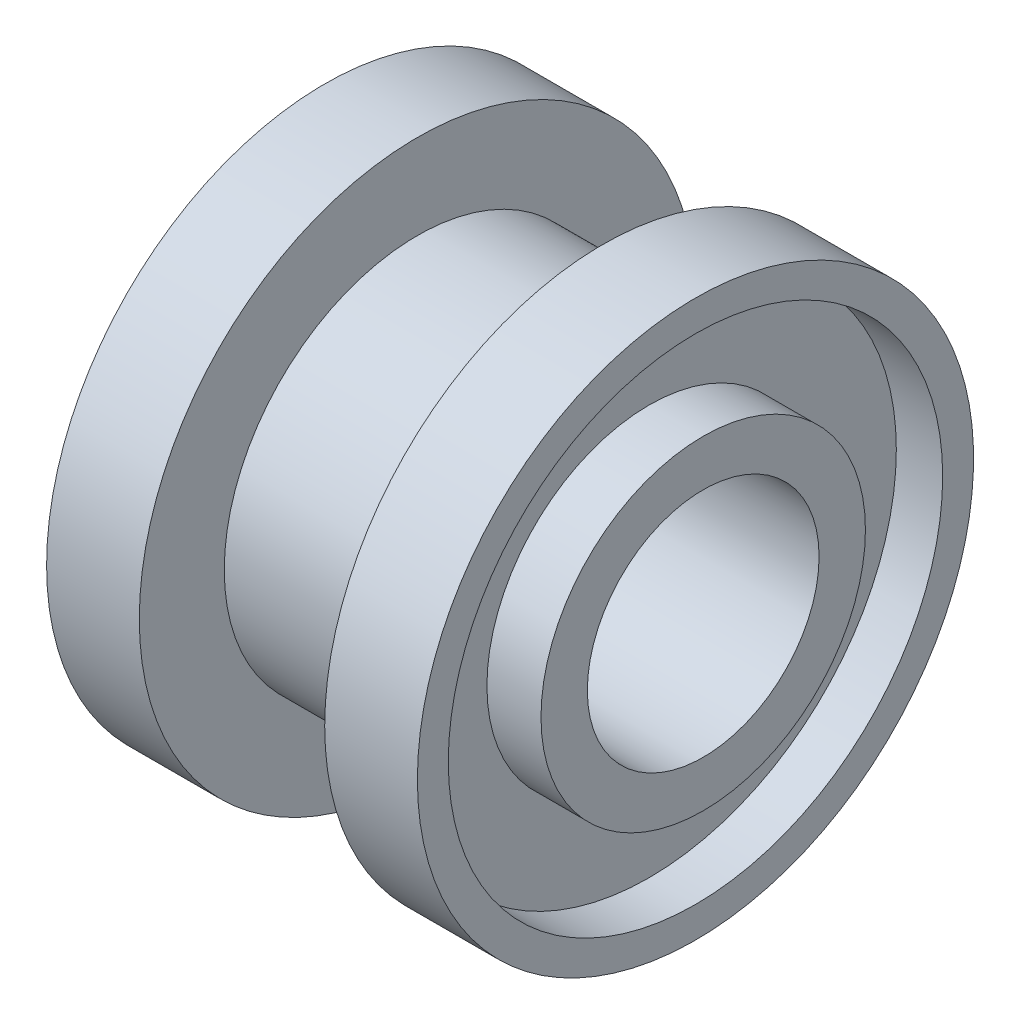
ISO-10303-21;
HEADER;
FILE_DESCRIPTION(('STEP AP214'),'2;1');
FILE_NAME('part.step','',(''),(''),'','','');
FILE_SCHEMA(('AUTOMOTIVE_DESIGN { 1 0 10303 214 1 1 1 1 }'));
ENDSEC;
DATA;
#1=APPLICATION_CONTEXT('core data for automotive mechanical design processes');
#2=APPLICATION_PROTOCOL_DEFINITION('international standard','automotive_design',2000,#1);
#3=PRODUCT_CONTEXT('',#1,'mechanical');
#4=PRODUCT('Part','Part','',(#3));
#5=PRODUCT_RELATED_PRODUCT_CATEGORY('part','',(#4));
#6=PRODUCT_DEFINITION_FORMATION('','',#4);
#7=PRODUCT_DEFINITION_CONTEXT('part definition',#1,'design');
#8=PRODUCT_DEFINITION('design','',#6,#7);
#9=PRODUCT_DEFINITION_SHAPE('','',#8);
#10=(LENGTH_UNIT() NAMED_UNIT(*) SI_UNIT(.MILLI.,.METRE.));
#11=(NAMED_UNIT(*) PLANE_ANGLE_UNIT() SI_UNIT($,.RADIAN.));
#12=(NAMED_UNIT(*) SI_UNIT($,.STERADIAN.) SOLID_ANGLE_UNIT());
#13=UNCERTAINTY_MEASURE_WITH_UNIT(LENGTH_MEASURE(1.E-05),#10,'distance_accuracy_value','');
#14=(GEOMETRIC_REPRESENTATION_CONTEXT(3) GLOBAL_UNCERTAINTY_ASSIGNED_CONTEXT((#13)) GLOBAL_UNIT_ASSIGNED_CONTEXT((#10,
#11,#12)) REPRESENTATION_CONTEXT('',''));
#15=CARTESIAN_POINT('',(0.,0.,0.));
#16=DIRECTION('',(0.,0.,1.));
#17=DIRECTION('',(1.,0.,0.));
#18=AXIS2_PLACEMENT_3D('',#15,#16,#17);
#19=CARTESIAN_POINT('',(-30.8374574674608,0.,0.));
#20=DIRECTION('',(-1.,0.,0.));
#21=DIRECTION('',(0.,0.,1.));
#22=AXIS2_PLACEMENT_3D('',#19,#20,#21);
#23=CYLINDRICAL_SURFACE('',#22,7.5);
#24=CARTESIAN_POINT('',(12.5,0.,0.));
#25=DIRECTION('',(-1.,0.,0.));
#26=DIRECTION('',(0.,0.,1.));
#27=AXIS2_PLACEMENT_3D('',#24,#25,#26);
#28=CIRCLE('',#27,7.5);
#29=CARTESIAN_POINT('',(12.5,0.,7.5));
#30=VERTEX_POINT('',#29);
#31=EDGE_CURVE('E89',#30,#30,#28,.T.);
#32=ORIENTED_EDGE('',*,*,#31,.F.);
#33=EDGE_LOOP('',(#32));
#34=FACE_BOUND('',#33,.T.);
#35=CARTESIAN_POINT('',(-12.5,0.,0.));
#36=DIRECTION('',(-1.,0.,0.));
#37=DIRECTION('',(0.,0.,1.));
#38=AXIS2_PLACEMENT_3D('',#35,#36,#37);
#39=CIRCLE('',#38,7.49999999999999);
#40=CARTESIAN_POINT('',(-12.5,0.,7.49999999999999));
#41=VERTEX_POINT('',#40);
#42=EDGE_CURVE('E10',#41,#41,#39,.T.);
#43=ORIENTED_EDGE('',*,*,#42,.T.);
#44=EDGE_LOOP('',(#43));
#45=FACE_BOUND('',#44,.T.);
#46=ADVANCED_FACE('F37',(#34,#45),#23,.F.);
#47=CARTESIAN_POINT('',(-12.5,7.49999999999999,0.));
#48=DIRECTION('',(1.,0.,0.));
#49=DIRECTION('',(0.,0.,-1.));
#50=AXIS2_PLACEMENT_3D('',#47,#48,#49);
#51=PLANE('',#50);
#52=ORIENTED_EDGE('',*,*,#42,.F.);
#53=EDGE_LOOP('',(#52));
#54=FACE_BOUND('',#53,.T.);
#55=CARTESIAN_POINT('',(-12.5,0.,0.));
#56=DIRECTION('',(-1.,0.,0.));
#57=DIRECTION('',(0.,0.,1.));
#58=AXIS2_PLACEMENT_3D('',#55,#56,#57);
#59=CIRCLE('',#58,10.5);
#60=CARTESIAN_POINT('',(-12.5,0.,10.5));
#61=VERTEX_POINT('',#60);
#62=EDGE_CURVE('E43',#61,#61,#59,.T.);
#63=ORIENTED_EDGE('',*,*,#62,.T.);
#64=EDGE_LOOP('',(#63));
#65=FACE_BOUND('',#64,.T.);
#66=ADVANCED_FACE('F177',(#54,#65),#51,.F.);
#67=CARTESIAN_POINT('',(-30.8374574674608,0.,0.));
#68=DIRECTION('',(-1.,0.,0.));
#69=DIRECTION('',(0.,0.,1.));
#70=AXIS2_PLACEMENT_3D('',#67,#68,#69);
#71=CYLINDRICAL_SURFACE('',#70,10.5);
#72=ORIENTED_EDGE('',*,*,#62,.F.);
#73=EDGE_LOOP('',(#72));
#74=FACE_BOUND('',#73,.T.);
#75=CARTESIAN_POINT('',(-9.,0.,0.));
#76=DIRECTION('',(-1.,0.,0.));
#77=DIRECTION('',(0.,0.,1.));
#78=AXIS2_PLACEMENT_3D('',#75,#76,#77);
#79=CIRCLE('',#78,10.5);
#80=CARTESIAN_POINT('',(-9.,0.,10.5));
#81=VERTEX_POINT('',#80);
#82=EDGE_CURVE('E47',#81,#81,#79,.T.);
#83=ORIENTED_EDGE('',*,*,#82,.T.);
#84=EDGE_LOOP('',(#83));
#85=FACE_BOUND('',#84,.T.);
#86=ADVANCED_FACE('F181',(#74,#85),#71,.T.);
#87=CARTESIAN_POINT('',(-9.,16.,0.));
#88=DIRECTION('',(1.,0.,0.));
#89=DIRECTION('',(0.,0.,-1.));
#90=AXIS2_PLACEMENT_3D('',#87,#88,#89);
#91=PLANE('',#90);
#92=ORIENTED_EDGE('',*,*,#82,.F.);
#93=EDGE_LOOP('',(#92));
#94=FACE_BOUND('',#93,.T.);
#95=CARTESIAN_POINT('',(-9.,0.,0.));
#96=DIRECTION('',(-1.,0.,0.));
#97=DIRECTION('',(0.,0.,1.));
#98=AXIS2_PLACEMENT_3D('',#95,#96,#97);
#99=CIRCLE('',#98,16.);
#100=CARTESIAN_POINT('',(-9.,0.,16.));
#101=VERTEX_POINT('',#100);
#102=EDGE_CURVE('E51',#101,#101,#99,.T.);
#103=ORIENTED_EDGE('',*,*,#102,.T.);
#104=EDGE_LOOP('',(#103));
#105=FACE_BOUND('',#104,.T.);
#106=ADVANCED_FACE('F186',(#94,#105),#91,.F.);
#107=CARTESIAN_POINT('',(-30.8374574674608,0.,0.));
#108=DIRECTION('',(-1.,0.,0.));
#109=DIRECTION('',(0.,0.,1.));
#110=AXIS2_PLACEMENT_3D('',#107,#108,#109);
#111=CYLINDRICAL_SURFACE('',#110,16.);
#112=ORIENTED_EDGE('',*,*,#102,.F.);
#113=EDGE_LOOP('',(#112));
#114=FACE_BOUND('',#113,.T.);
#115=CARTESIAN_POINT('',(-12.,0.,0.));
#116=DIRECTION('',(-1.,0.,0.));
#117=DIRECTION('',(0.,0.,1.));
#118=AXIS2_PLACEMENT_3D('',#115,#116,#117);
#119=CIRCLE('',#118,16.);
#120=CARTESIAN_POINT('',(-12.,0.,16.));
#121=VERTEX_POINT('',#120);
#122=EDGE_CURVE('E56',#121,#121,#119,.T.);
#123=ORIENTED_EDGE('',*,*,#122,.T.);
#124=EDGE_LOOP('',(#123));
#125=FACE_BOUND('',#124,.T.);
#126=ADVANCED_FACE('F112',(#114,#125),#111,.F.);
#127=CARTESIAN_POINT('',(-12.,18.,0.));
#128=DIRECTION('',(1.,0.,0.));
#129=DIRECTION('',(0.,0.,-1.));
#130=AXIS2_PLACEMENT_3D('',#127,#128,#129);
#131=PLANE('',#130);
#132=CARTESIAN_POINT('',(-12.,17.,0.));
#133=DIRECTION('',(-1.,0.,0.));
#134=DIRECTION('',(0.,0.,1.));
#135=AXIS2_PLACEMENT_3D('',#132,#133,#134);
#136=CIRCLE('',#135,0.5);
#137=CARTESIAN_POINT('',(-12.,17.,0.5));
#138=VERTEX_POINT('',#137);
#139=EDGE_CURVE('E93',#138,#138,#136,.T.);
#140=ORIENTED_EDGE('',*,*,#139,.F.);
#141=EDGE_LOOP('',(#140));
#142=FACE_BOUND('',#141,.T.);
#143=ORIENTED_EDGE('',*,*,#122,.F.);
#144=EDGE_LOOP('',(#143));
#145=FACE_BOUND('',#144,.T.);
#146=CARTESIAN_POINT('',(-12.,0.,0.));
#147=DIRECTION('',(-1.,0.,0.));
#148=DIRECTION('',(0.,0.,1.));
#149=AXIS2_PLACEMENT_3D('',#146,#147,#148);
#150=CIRCLE('',#149,18.);
#151=CARTESIAN_POINT('',(-12.,0.,18.));
#152=VERTEX_POINT('',#151);
#153=EDGE_CURVE('E59',#152,#152,#150,.T.);
#154=ORIENTED_EDGE('',*,*,#153,.T.);
#155=EDGE_LOOP('',(#154));
#156=FACE_BOUND('',#155,.T.);
#157=ADVANCED_FACE('F108',(#142,#145,#156),#131,.F.);
#158=CARTESIAN_POINT('',(-30.8374574674608,0.,0.));
#159=DIRECTION('',(-1.,0.,0.));
#160=DIRECTION('',(0.,0.,1.));
#161=AXIS2_PLACEMENT_3D('',#158,#159,#160);
#162=CYLINDRICAL_SURFACE('',#161,18.);
#163=ORIENTED_EDGE('',*,*,#153,.F.);
#164=EDGE_LOOP('',(#163));
#165=FACE_BOUND('',#164,.T.);
#166=CARTESIAN_POINT('',(-6.,0.,0.));
#167=DIRECTION('',(-1.,0.,0.));
#168=DIRECTION('',(0.,0.,1.));
#169=AXIS2_PLACEMENT_3D('',#166,#167,#168);
#170=CIRCLE('',#169,18.);
#171=CARTESIAN_POINT('',(-6.,0.,18.));
#172=VERTEX_POINT('',#171);
#173=EDGE_CURVE('E62',#172,#172,#170,.T.);
#174=ORIENTED_EDGE('',*,*,#173,.T.);
#175=EDGE_LOOP('',(#174));
#176=FACE_BOUND('',#175,.T.);
#177=ADVANCED_FACE('F111',(#165,#176),#162,.T.);
#178=CARTESIAN_POINT('',(-6.,12.5,0.));
#179=DIRECTION('',(-1.,0.,0.));
#180=DIRECTION('',(0.,0.,1.));
#181=AXIS2_PLACEMENT_3D('',#178,#179,#180);
#182=PLANE('',#181);
#183=ORIENTED_EDGE('',*,*,#173,.F.);
#184=EDGE_LOOP('',(#183));
#185=FACE_BOUND('',#184,.T.);
#186=CARTESIAN_POINT('',(-6.,0.,0.));
#187=DIRECTION('',(-1.,0.,0.));
#188=DIRECTION('',(0.,0.,1.));
#189=AXIS2_PLACEMENT_3D('',#186,#187,#188);
#190=CIRCLE('',#189,12.5);
#191=CARTESIAN_POINT('',(-6.,0.,12.5));
#192=VERTEX_POINT('',#191);
#193=EDGE_CURVE('E65',#192,#192,#190,.T.);
#194=ORIENTED_EDGE('',*,*,#193,.T.);
#195=EDGE_LOOP('',(#194));
#196=FACE_BOUND('',#195,.T.);
#197=ADVANCED_FACE('F120',(#185,#196),#182,.F.);
#198=CARTESIAN_POINT('',(-30.8374574674608,0.,0.));
#199=DIRECTION('',(-1.,0.,0.));
#200=DIRECTION('',(0.,0.,1.));
#201=AXIS2_PLACEMENT_3D('',#198,#199,#200);
#202=CYLINDRICAL_SURFACE('',#201,12.5);
#203=ORIENTED_EDGE('',*,*,#193,.F.);
#204=EDGE_LOOP('',(#203));
#205=FACE_BOUND('',#204,.T.);
#206=CARTESIAN_POINT('',(6.,0.,0.));
#207=DIRECTION('',(-1.,0.,0.));
#208=DIRECTION('',(0.,0.,1.));
#209=AXIS2_PLACEMENT_3D('',#206,#207,#208);
#210=CIRCLE('',#209,12.5);
#211=CARTESIAN_POINT('',(6.,0.,12.5));
#212=VERTEX_POINT('',#211);
#213=EDGE_CURVE('E68',#212,#212,#210,.T.);
#214=ORIENTED_EDGE('',*,*,#213,.T.);
#215=EDGE_LOOP('',(#214));
#216=FACE_BOUND('',#215,.T.);
#217=ADVANCED_FACE('F126',(#205,#216),#202,.T.);
#218=CARTESIAN_POINT('',(6.,12.5,0.));
#219=DIRECTION('',(1.,0.,0.));
#220=DIRECTION('',(0.,0.,-1.));
#221=AXIS2_PLACEMENT_3D('',#218,#219,#220);
#222=PLANE('',#221);
#223=ORIENTED_EDGE('',*,*,#213,.F.);
#224=EDGE_LOOP('',(#223));
#225=FACE_BOUND('',#224,.T.);
#226=CARTESIAN_POINT('',(6.,0.,0.));
#227=DIRECTION('',(-1.,0.,0.));
#228=DIRECTION('',(0.,0.,1.));
#229=AXIS2_PLACEMENT_3D('',#226,#227,#228);
#230=CIRCLE('',#229,18.);
#231=CARTESIAN_POINT('',(6.,0.,18.));
#232=VERTEX_POINT('',#231);
#233=EDGE_CURVE('E71',#232,#232,#230,.T.);
#234=ORIENTED_EDGE('',*,*,#233,.T.);
#235=EDGE_LOOP('',(#234));
#236=FACE_BOUND('',#235,.T.);
#237=ADVANCED_FACE('F132',(#225,#236),#222,.F.);
#238=CARTESIAN_POINT('',(-30.8374574674608,0.,0.));
#239=DIRECTION('',(-1.,0.,0.));
#240=DIRECTION('',(0.,0.,1.));
#241=AXIS2_PLACEMENT_3D('',#238,#239,#240);
#242=CYLINDRICAL_SURFACE('',#241,18.);
#243=ORIENTED_EDGE('',*,*,#233,.F.);
#244=EDGE_LOOP('',(#243));
#245=FACE_BOUND('',#244,.T.);
#246=CARTESIAN_POINT('',(12.,0.,0.));
#247=DIRECTION('',(-1.,0.,0.));
#248=DIRECTION('',(0.,0.,1.));
#249=AXIS2_PLACEMENT_3D('',#246,#247,#248);
#250=CIRCLE('',#249,18.);
#251=CARTESIAN_POINT('',(12.,0.,18.));
#252=VERTEX_POINT('',#251);
#253=EDGE_CURVE('E74',#252,#252,#250,.T.);
#254=ORIENTED_EDGE('',*,*,#253,.T.);
#255=EDGE_LOOP('',(#254));
#256=FACE_BOUND('',#255,.T.);
#257=ADVANCED_FACE('F138',(#245,#256),#242,.T.);
#258=CARTESIAN_POINT('',(12.,18.,0.));
#259=DIRECTION('',(-1.,0.,0.));
#260=DIRECTION('',(0.,0.,1.));
#261=AXIS2_PLACEMENT_3D('',#258,#259,#260);
#262=PLANE('',#261);
#263=ORIENTED_EDGE('',*,*,#253,.F.);
#264=EDGE_LOOP('',(#263));
#265=FACE_BOUND('',#264,.T.);
#266=CARTESIAN_POINT('',(12.,0.,0.));
#267=DIRECTION('',(-1.,0.,0.));
#268=DIRECTION('',(0.,0.,1.));
#269=AXIS2_PLACEMENT_3D('',#266,#267,#268);
#270=CIRCLE('',#269,16.);
#271=CARTESIAN_POINT('',(12.,0.,16.));
#272=VERTEX_POINT('',#271);
#273=EDGE_CURVE('E77',#272,#272,#270,.T.);
#274=ORIENTED_EDGE('',*,*,#273,.T.);
#275=EDGE_LOOP('',(#274));
#276=FACE_BOUND('',#275,.T.);
#277=ADVANCED_FACE('F144',(#265,#276),#262,.F.);
#278=CARTESIAN_POINT('',(-30.8374574674608,0.,0.));
#279=DIRECTION('',(-1.,0.,0.));
#280=DIRECTION('',(0.,0.,1.));
#281=AXIS2_PLACEMENT_3D('',#278,#279,#280);
#282=CYLINDRICAL_SURFACE('',#281,16.);
#283=ORIENTED_EDGE('',*,*,#273,.F.);
#284=EDGE_LOOP('',(#283));
#285=FACE_BOUND('',#284,.T.);
#286=CARTESIAN_POINT('',(9.,0.,0.));
#287=DIRECTION('',(-1.,0.,0.));
#288=DIRECTION('',(0.,0.,1.));
#289=AXIS2_PLACEMENT_3D('',#286,#287,#288);
#290=CIRCLE('',#289,16.);
#291=CARTESIAN_POINT('',(9.,0.,16.));
#292=VERTEX_POINT('',#291);
#293=EDGE_CURVE('E80',#292,#292,#290,.T.);
#294=ORIENTED_EDGE('',*,*,#293,.T.);
#295=EDGE_LOOP('',(#294));
#296=FACE_BOUND('',#295,.T.);
#297=ADVANCED_FACE('F150',(#285,#296),#282,.F.);
#298=CARTESIAN_POINT('',(9.,16.,0.));
#299=DIRECTION('',(-1.,0.,0.));
#300=DIRECTION('',(0.,0.,1.));
#301=AXIS2_PLACEMENT_3D('',#298,#299,#300);
#302=PLANE('',#301);
#303=ORIENTED_EDGE('',*,*,#293,.F.);
#304=EDGE_LOOP('',(#303));
#305=FACE_BOUND('',#304,.T.);
#306=CARTESIAN_POINT('',(9.,0.,0.));
#307=DIRECTION('',(-1.,0.,0.));
#308=DIRECTION('',(0.,0.,1.));
#309=AXIS2_PLACEMENT_3D('',#306,#307,#308);
#310=CIRCLE('',#309,10.5);
#311=CARTESIAN_POINT('',(9.,0.,10.5));
#312=VERTEX_POINT('',#311);
#313=EDGE_CURVE('E83',#312,#312,#310,.T.);
#314=ORIENTED_EDGE('',*,*,#313,.T.);
#315=EDGE_LOOP('',(#314));
#316=FACE_BOUND('',#315,.T.);
#317=ADVANCED_FACE('F156',(#305,#316),#302,.F.);
#318=CARTESIAN_POINT('',(-30.8374574674608,0.,0.));
#319=DIRECTION('',(-1.,0.,0.));
#320=DIRECTION('',(0.,0.,1.));
#321=AXIS2_PLACEMENT_3D('',#318,#319,#320);
#322=CYLINDRICAL_SURFACE('',#321,10.5);
#323=ORIENTED_EDGE('',*,*,#313,.F.);
#324=EDGE_LOOP('',(#323));
#325=FACE_BOUND('',#324,.T.);
#326=CARTESIAN_POINT('',(12.5,0.,0.));
#327=DIRECTION('',(-1.,0.,0.));
#328=DIRECTION('',(0.,0.,1.));
#329=AXIS2_PLACEMENT_3D('',#326,#327,#328);
#330=CIRCLE('',#329,10.5);
#331=CARTESIAN_POINT('',(12.5,0.,10.5));
#332=VERTEX_POINT('',#331);
#333=EDGE_CURVE('E86',#332,#332,#330,.T.);
#334=ORIENTED_EDGE('',*,*,#333,.T.);
#335=EDGE_LOOP('',(#334));
#336=FACE_BOUND('',#335,.T.);
#337=ADVANCED_FACE('F162',(#325,#336),#322,.T.);
#338=CARTESIAN_POINT('',(12.5,7.5,0.));
#339=DIRECTION('',(-1.,0.,0.));
#340=DIRECTION('',(0.,0.,1.));
#341=AXIS2_PLACEMENT_3D('',#338,#339,#340);
#342=PLANE('',#341);
#343=ORIENTED_EDGE('',*,*,#333,.F.);
#344=EDGE_LOOP('',(#343));
#345=FACE_BOUND('',#344,.T.);
#346=ORIENTED_EDGE('',*,*,#31,.T.);
#347=EDGE_LOOP('',(#346));
#348=FACE_BOUND('',#347,.T.);
#349=ADVANCED_FACE('F104',(#345,#348),#342,.F.);
#350=CARTESIAN_POINT('',(-11.,17.,0.));
#351=DIRECTION('',(-1.,0.,0.));
#352=DIRECTION('',(0.,0.,1.));
#353=AXIS2_PLACEMENT_3D('',#350,#351,#352);
#354=CYLINDRICAL_SURFACE('',#353,0.5);
#355=CARTESIAN_POINT('',(-11.,17.,0.));
#356=DIRECTION('',(-1.,0.,0.));
#357=DIRECTION('',(0.,0.,1.));
#358=AXIS2_PLACEMENT_3D('',#355,#356,#357);
#359=CIRCLE('',#358,0.5);
#360=CARTESIAN_POINT('',(-11.,17.,0.5));
#361=VERTEX_POINT('',#360);
#362=EDGE_CURVE('E92',#361,#361,#359,.T.);
#363=ORIENTED_EDGE('',*,*,#362,.F.);
#364=EDGE_LOOP('',(#363));
#365=FACE_BOUND('',#364,.T.);
#366=ORIENTED_EDGE('',*,*,#139,.T.);
#367=EDGE_LOOP('',(#366));
#368=FACE_BOUND('',#367,.T.);
#369=ADVANCED_FACE('F101',(#365,#368),#354,.F.);
#370=CARTESIAN_POINT('',(-11.,17.,0.));
#371=DIRECTION('',(-1.,0.,0.));
#372=DIRECTION('',(0.,0.,1.));
#373=AXIS2_PLACEMENT_3D('',#370,#371,#372);
#374=PLANE('',#373);
#375=ORIENTED_EDGE('',*,*,#362,.T.);
#376=EDGE_LOOP('',(#375));
#377=FACE_BOUND('',#376,.T.);
#378=ADVANCED_FACE('F99',(#377),#374,.T.);
#379=CLOSED_SHELL('',(#46,#66,#86,#106,#126,#157,#177,#197,#217,#237,#257,#277,#297,#317,#337,
#349,#369,#378));
#380=MANIFOLD_SOLID_BREP('B2',#379);
#381=ADVANCED_BREP_SHAPE_REPRESENTATION('',(#18,#380),#14);
#382=SHAPE_DEFINITION_REPRESENTATION(#9,#381);
ENDSEC;
END-ISO-10303-21;
